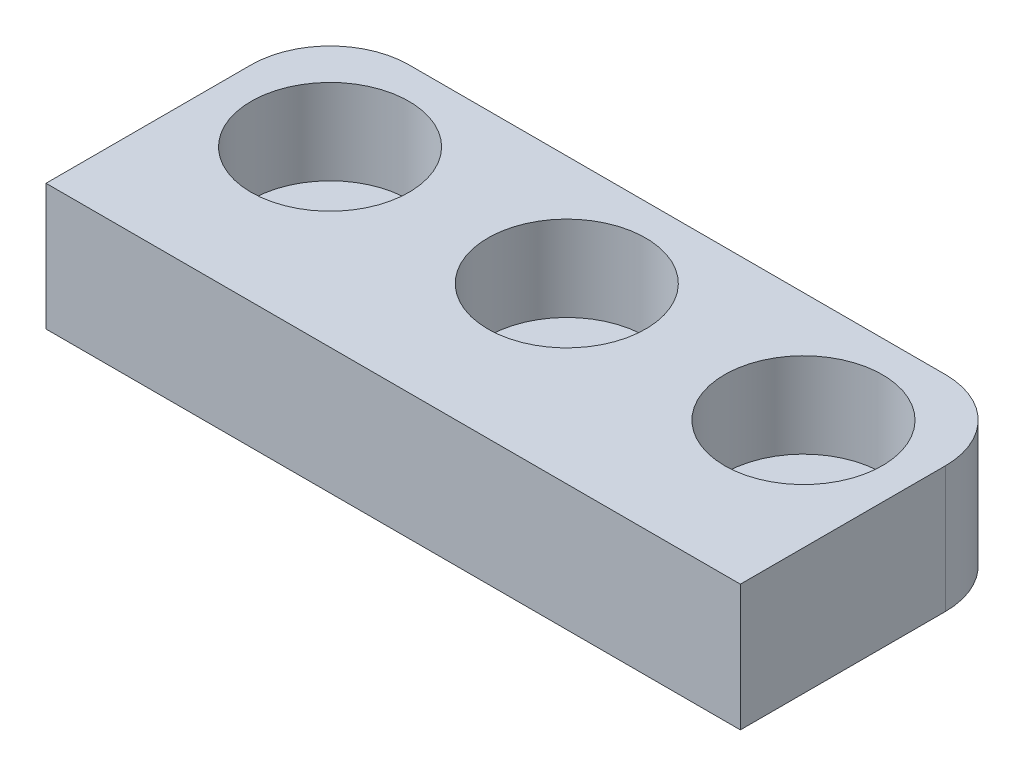
ISO-10303-21;
HEADER;
FILE_DESCRIPTION(('STEP AP214'),'2;1');
FILE_NAME('part.step','',(''),(''),'','','');
FILE_SCHEMA(('AUTOMOTIVE_DESIGN { 1 0 10303 214 1 1 1 1 }'));
ENDSEC;
DATA;
#1=APPLICATION_CONTEXT('core data for automotive mechanical design processes');
#2=APPLICATION_PROTOCOL_DEFINITION('international standard','automotive_design',2000,#1);
#3=PRODUCT_CONTEXT('',#1,'mechanical');
#4=PRODUCT('Part','Part','',(#3));
#5=PRODUCT_RELATED_PRODUCT_CATEGORY('part','',(#4));
#6=PRODUCT_DEFINITION_FORMATION('','',#4);
#7=PRODUCT_DEFINITION_CONTEXT('part definition',#1,'design');
#8=PRODUCT_DEFINITION('design','',#6,#7);
#9=PRODUCT_DEFINITION_SHAPE('','',#8);
#10=(LENGTH_UNIT() NAMED_UNIT(*) SI_UNIT(.MILLI.,.METRE.));
#11=(NAMED_UNIT(*) PLANE_ANGLE_UNIT() SI_UNIT($,.RADIAN.));
#12=(NAMED_UNIT(*) SI_UNIT($,.STERADIAN.) SOLID_ANGLE_UNIT());
#13=UNCERTAINTY_MEASURE_WITH_UNIT(LENGTH_MEASURE(1.E-05),#10,'distance_accuracy_value','');
#14=(GEOMETRIC_REPRESENTATION_CONTEXT(3) GLOBAL_UNCERTAINTY_ASSIGNED_CONTEXT((#13)) GLOBAL_UNIT_ASSIGNED_CONTEXT((#10,
#11,#12)) REPRESENTATION_CONTEXT('',''));
#15=CARTESIAN_POINT('',(0.,0.,0.));
#16=DIRECTION('',(0.,0.,1.));
#17=DIRECTION('',(1.,0.,0.));
#18=AXIS2_PLACEMENT_3D('',#15,#16,#17);
#19=CARTESIAN_POINT('',(22.,-8.,9.));
#20=DIRECTION('',(1.,0.,0.));
#21=DIRECTION('',(0.,0.,-1.));
#22=AXIS2_PLACEMENT_3D('',#19,#20,#21);
#23=PLANE('',#22);
#24=DIRECTION('',(0.,0.,-1.));
#25=VECTOR('',#24,1.);
#26=CARTESIAN_POINT('',(22.,-8.,9.));
#27=LINE('',#26,#25);
#28=CARTESIAN_POINT('',(22.,-8.,9.));
#29=VERTEX_POINT('',#28);
#30=CARTESIAN_POINT('',(22.,-8.,-4.));
#31=VERTEX_POINT('',#30);
#32=EDGE_CURVE('E111',#29,#31,#27,.T.);
#33=ORIENTED_EDGE('',*,*,#32,.T.);
#34=DIRECTION('',(0.,1.,0.));
#35=VECTOR('',#34,1.);
#36=CARTESIAN_POINT('',(22.,-8.,-4.));
#37=LINE('',#36,#35);
#38=CARTESIAN_POINT('',(22.,0.,-4.));
#39=VERTEX_POINT('',#38);
#40=EDGE_CURVE('E125',#31,#39,#37,.T.);
#41=ORIENTED_EDGE('',*,*,#40,.T.);
#42=DIRECTION('',(0.,0.,-1.));
#43=VECTOR('',#42,1.);
#44=CARTESIAN_POINT('',(22.,0.,9.));
#45=LINE('',#44,#43);
#46=CARTESIAN_POINT('',(22.,0.,9.));
#47=VERTEX_POINT('',#46);
#48=EDGE_CURVE('E115',#47,#39,#45,.T.);
#49=ORIENTED_EDGE('',*,*,#48,.F.);
#50=DIRECTION('',(0.,1.,0.));
#51=VECTOR('',#50,1.);
#52=CARTESIAN_POINT('',(22.,-8.,9.));
#53=LINE('',#52,#51);
#54=EDGE_CURVE('E106',#29,#47,#53,.T.);
#55=ORIENTED_EDGE('',*,*,#54,.F.);
#56=EDGE_LOOP('',(#33,#41,#49,#55));
#57=FACE_BOUND('',#56,.T.);
#58=ADVANCED_FACE('F41',(#57),#23,.T.);
#59=CARTESIAN_POINT('',(-22.,-8.,9.));
#60=DIRECTION('',(0.,0.,1.));
#61=DIRECTION('',(1.,0.,0.));
#62=AXIS2_PLACEMENT_3D('',#59,#60,#61);
#63=PLANE('',#62);
#64=DIRECTION('',(1.,0.,0.));
#65=VECTOR('',#64,1.);
#66=CARTESIAN_POINT('',(-22.,0.,9.));
#67=LINE('',#66,#65);
#68=CARTESIAN_POINT('',(-22.,0.,9.));
#69=VERTEX_POINT('',#68);
#70=EDGE_CURVE('E105',#69,#47,#67,.T.);
#71=ORIENTED_EDGE('',*,*,#70,.F.);
#72=DIRECTION('',(0.,1.,0.));
#73=VECTOR('',#72,1.);
#74=CARTESIAN_POINT('',(-22.,-8.,9.));
#75=LINE('',#74,#73);
#76=CARTESIAN_POINT('',(-22.,-8.,9.));
#77=VERTEX_POINT('',#76);
#78=EDGE_CURVE('E95',#77,#69,#75,.T.);
#79=ORIENTED_EDGE('',*,*,#78,.F.);
#80=DIRECTION('',(1.,0.,0.));
#81=VECTOR('',#80,1.);
#82=CARTESIAN_POINT('',(-22.,-8.,9.));
#83=LINE('',#82,#81);
#84=EDGE_CURVE('E98',#77,#29,#83,.T.);
#85=ORIENTED_EDGE('',*,*,#84,.T.);
#86=ORIENTED_EDGE('',*,*,#54,.T.);
#87=EDGE_LOOP('',(#71,#79,#85,#86));
#88=FACE_BOUND('',#87,.T.);
#89=ADVANCED_FACE('F103',(#88),#63,.T.);
#90=CARTESIAN_POINT('',(-22.,-8.,9.));
#91=DIRECTION('',(-1.,0.,0.));
#92=DIRECTION('',(0.,0.,1.));
#93=AXIS2_PLACEMENT_3D('',#90,#91,#92);
#94=PLANE('',#93);
#95=DIRECTION('',(0.,0.,1.));
#96=VECTOR('',#95,1.);
#97=CARTESIAN_POINT('',(-22.,0.,9.));
#98=LINE('',#97,#96);
#99=CARTESIAN_POINT('',(-22.,0.,-4.));
#100=VERTEX_POINT('',#99);
#101=EDGE_CURVE('E122',#100,#69,#98,.T.);
#102=ORIENTED_EDGE('',*,*,#101,.F.);
#103=DIRECTION('',(0.,1.,0.));
#104=VECTOR('',#103,1.);
#105=CARTESIAN_POINT('',(-22.,-8.,-4.));
#106=LINE('',#105,#104);
#107=CARTESIAN_POINT('',(-22.,-8.,-4.));
#108=VERTEX_POINT('',#107);
#109=EDGE_CURVE('E11',#100,#108,#106,.F.);
#110=ORIENTED_EDGE('',*,*,#109,.T.);
#111=DIRECTION('',(0.,0.,1.));
#112=VECTOR('',#111,1.);
#113=CARTESIAN_POINT('',(-22.,-8.,9.));
#114=LINE('',#113,#112);
#115=EDGE_CURVE('E92',#108,#77,#114,.T.);
#116=ORIENTED_EDGE('',*,*,#115,.T.);
#117=ORIENTED_EDGE('',*,*,#78,.T.);
#118=EDGE_LOOP('',(#102,#110,#116,#117));
#119=FACE_BOUND('',#118,.T.);
#120=ADVANCED_FACE('F94',(#119),#94,.T.);
#121=CARTESIAN_POINT('',(-22.,-8.,-9.));
#122=DIRECTION('',(0.,0.,-1.));
#123=DIRECTION('',(-1.,0.,0.));
#124=AXIS2_PLACEMENT_3D('',#121,#122,#123);
#125=PLANE('',#124);
#126=DIRECTION('',(-1.,0.,0.));
#127=VECTOR('',#126,1.);
#128=CARTESIAN_POINT('',(-22.,0.,-9.));
#129=LINE('',#128,#127);
#130=CARTESIAN_POINT('',(17.,0.,-9.));
#131=VERTEX_POINT('',#130);
#132=CARTESIAN_POINT('',(-17.,0.,-9.));
#133=VERTEX_POINT('',#132);
#134=EDGE_CURVE('E118',#131,#133,#129,.T.);
#135=ORIENTED_EDGE('',*,*,#134,.F.);
#136=DIRECTION('',(0.,1.,0.));
#137=VECTOR('',#136,1.);
#138=CARTESIAN_POINT('',(17.,-8.,-9.));
#139=LINE('',#138,#137);
#140=CARTESIAN_POINT('',(17.,-8.,-9.));
#141=VERTEX_POINT('',#140);
#142=EDGE_CURVE('E136',#131,#141,#139,.F.);
#143=ORIENTED_EDGE('',*,*,#142,.T.);
#144=DIRECTION('',(-1.,0.,0.));
#145=VECTOR('',#144,1.);
#146=CARTESIAN_POINT('',(-22.,-8.,-9.));
#147=LINE('',#146,#145);
#148=CARTESIAN_POINT('',(-17.,-8.,-9.));
#149=VERTEX_POINT('',#148);
#150=EDGE_CURVE('E99',#141,#149,#147,.T.);
#151=ORIENTED_EDGE('',*,*,#150,.T.);
#152=DIRECTION('',(0.,1.,0.));
#153=VECTOR('',#152,1.);
#154=CARTESIAN_POINT('',(-17.,-8.,-9.));
#155=LINE('',#154,#153);
#156=EDGE_CURVE('E133',#149,#133,#155,.T.);
#157=ORIENTED_EDGE('',*,*,#156,.T.);
#158=EDGE_LOOP('',(#135,#143,#151,#157));
#159=FACE_BOUND('',#158,.T.);
#160=ADVANCED_FACE('F150',(#159),#125,.T.);
#161=CARTESIAN_POINT('',(0.,-8.,0.));
#162=DIRECTION('',(0.,-1.,0.));
#163=DIRECTION('',(0.,0.,-1.));
#164=AXIS2_PLACEMENT_3D('',#161,#162,#163);
#165=PLANE('',#164);
#166=CARTESIAN_POINT('',(-15.,-8.,-2.));
#167=DIRECTION('',(0.,1.,0.));
#168=DIRECTION('',(0.,0.,1.));
#169=AXIS2_PLACEMENT_3D('',#166,#167,#168);
#170=CIRCLE('',#169,2.65);
#171=CARTESIAN_POINT('',(-15.,-8.,0.65));
#172=VERTEX_POINT('',#171);
#173=EDGE_CURVE('E224',#172,#172,#170,.T.);
#174=ORIENTED_EDGE('',*,*,#173,.T.);
#175=EDGE_LOOP('',(#174));
#176=FACE_BOUND('',#175,.T.);
#177=CARTESIAN_POINT('',(0.,-8.,-2.));
#178=DIRECTION('',(0.,1.,0.));
#179=DIRECTION('',(0.,0.,1.));
#180=AXIS2_PLACEMENT_3D('',#177,#178,#179);
#181=CIRCLE('',#180,2.65);
#182=CARTESIAN_POINT('',(0.,-8.,0.65));
#183=VERTEX_POINT('',#182);
#184=EDGE_CURVE('E236',#183,#183,#181,.T.);
#185=ORIENTED_EDGE('',*,*,#184,.T.);
#186=EDGE_LOOP('',(#185));
#187=FACE_BOUND('',#186,.T.);
#188=CARTESIAN_POINT('',(15.,-8.,-2.));
#189=DIRECTION('',(0.,1.,0.));
#190=DIRECTION('',(0.,0.,1.));
#191=AXIS2_PLACEMENT_3D('',#188,#189,#190);
#192=CIRCLE('',#191,2.65);
#193=CARTESIAN_POINT('',(15.,-8.,0.649999999999997));
#194=VERTEX_POINT('',#193);
#195=EDGE_CURVE('E119',#194,#194,#192,.T.);
#196=ORIENTED_EDGE('',*,*,#195,.T.);
#197=EDGE_LOOP('',(#196));
#198=FACE_BOUND('',#197,.T.);
#199=ORIENTED_EDGE('',*,*,#150,.F.);
#200=CARTESIAN_POINT('',(17.,-8.,-4.));
#201=DIRECTION('',(0.,-1.,0.));
#202=DIRECTION('',(0.,0.,-1.));
#203=AXIS2_PLACEMENT_3D('',#200,#201,#202);
#204=CIRCLE('',#203,5.);
#205=EDGE_CURVE('E49',#141,#31,#204,.T.);
#206=ORIENTED_EDGE('',*,*,#205,.T.);
#207=ORIENTED_EDGE('',*,*,#32,.F.);
#208=ORIENTED_EDGE('',*,*,#84,.F.);
#209=ORIENTED_EDGE('',*,*,#115,.F.);
#210=CARTESIAN_POINT('',(-17.,-8.,-4.));
#211=DIRECTION('',(0.,-1.,0.));
#212=DIRECTION('',(0.,0.,-1.));
#213=AXIS2_PLACEMENT_3D('',#210,#211,#212);
#214=CIRCLE('',#213,5.);
#215=EDGE_CURVE('E61',#108,#149,#214,.T.);
#216=ORIENTED_EDGE('',*,*,#215,.T.);
#217=EDGE_LOOP('',(#199,#206,#207,#208,#209,#216));
#218=FACE_BOUND('',#217,.T.);
#219=ADVANCED_FACE('F109',(#176,#187,#198,#218),#165,.T.);
#220=CARTESIAN_POINT('',(0.,0.,0.));
#221=DIRECTION('',(0.,-1.,0.));
#222=DIRECTION('',(0.,0.,-1.));
#223=AXIS2_PLACEMENT_3D('',#220,#221,#222);
#224=PLANE('',#223);
#225=CARTESIAN_POINT('',(-15.,0.,-2.));
#226=DIRECTION('',(0.,1.,0.));
#227=DIRECTION('',(0.,0.,1.));
#228=AXIS2_PLACEMENT_3D('',#225,#226,#227);
#229=CIRCLE('',#228,5.);
#230=CARTESIAN_POINT('',(-15.,0.,3.));
#231=VERTEX_POINT('',#230);
#232=EDGE_CURVE('E217',#231,#231,#229,.T.);
#233=ORIENTED_EDGE('',*,*,#232,.F.);
#234=EDGE_LOOP('',(#233));
#235=FACE_BOUND('',#234,.T.);
#236=CARTESIAN_POINT('',(0.,0.,-2.));
#237=DIRECTION('',(0.,1.,0.));
#238=DIRECTION('',(0.,0.,1.));
#239=AXIS2_PLACEMENT_3D('',#236,#237,#238);
#240=CIRCLE('',#239,5.);
#241=CARTESIAN_POINT('',(0.,0.,3.));
#242=VERTEX_POINT('',#241);
#243=EDGE_CURVE('E227',#242,#242,#240,.T.);
#244=ORIENTED_EDGE('',*,*,#243,.F.);
#245=EDGE_LOOP('',(#244));
#246=FACE_BOUND('',#245,.T.);
#247=CARTESIAN_POINT('',(15.,0.,-2.));
#248=DIRECTION('',(0.,1.,0.));
#249=DIRECTION('',(0.,0.,1.));
#250=AXIS2_PLACEMENT_3D('',#247,#248,#249);
#251=CIRCLE('',#250,5.);
#252=CARTESIAN_POINT('',(15.,0.,3.));
#253=VERTEX_POINT('',#252);
#254=EDGE_CURVE('E239',#253,#253,#251,.T.);
#255=ORIENTED_EDGE('',*,*,#254,.F.);
#256=EDGE_LOOP('',(#255));
#257=FACE_BOUND('',#256,.T.);
#258=ORIENTED_EDGE('',*,*,#48,.T.);
#259=CARTESIAN_POINT('',(17.,0.,-4.));
#260=DIRECTION('',(0.,-1.,0.));
#261=DIRECTION('',(0.,0.,-1.));
#262=AXIS2_PLACEMENT_3D('',#259,#260,#261);
#263=CIRCLE('',#262,5.);
#264=EDGE_CURVE('E131',#39,#131,#263,.F.);
#265=ORIENTED_EDGE('',*,*,#264,.T.);
#266=ORIENTED_EDGE('',*,*,#134,.T.);
#267=CARTESIAN_POINT('',(-17.,0.,-4.));
#268=DIRECTION('',(0.,-1.,0.));
#269=DIRECTION('',(0.,0.,-1.));
#270=AXIS2_PLACEMENT_3D('',#267,#268,#269);
#271=CIRCLE('',#270,5.);
#272=EDGE_CURVE('E129',#133,#100,#271,.F.);
#273=ORIENTED_EDGE('',*,*,#272,.T.);
#274=ORIENTED_EDGE('',*,*,#101,.T.);
#275=ORIENTED_EDGE('',*,*,#70,.T.);
#276=EDGE_LOOP('',(#258,#265,#266,#273,#274,#275));
#277=FACE_BOUND('',#276,.T.);
#278=ADVANCED_FACE('F148',(#235,#246,#257,#277),#224,.F.);
#279=CARTESIAN_POINT('',(15.,0.,-2.));
#280=DIRECTION('',(0.,1.,0.));
#281=DIRECTION('',(0.,0.,1.));
#282=AXIS2_PLACEMENT_3D('',#279,#280,#281);
#283=CYLINDRICAL_SURFACE('',#282,2.65);
#284=ORIENTED_EDGE('',*,*,#195,.F.);
#285=EDGE_LOOP('',(#284));
#286=FACE_BOUND('',#285,.T.);
#287=CARTESIAN_POINT('',(15.,-5.4,-2.));
#288=DIRECTION('',(0.,1.,0.));
#289=DIRECTION('',(0.,0.,1.));
#290=AXIS2_PLACEMENT_3D('',#287,#288,#289);
#291=CIRCLE('',#290,2.65);
#292=CARTESIAN_POINT('',(15.,-5.4,0.649999999999997));
#293=VERTEX_POINT('',#292);
#294=EDGE_CURVE('E245',#293,#293,#291,.T.);
#295=ORIENTED_EDGE('',*,*,#294,.T.);
#296=EDGE_LOOP('',(#295));
#297=FACE_BOUND('',#296,.T.);
#298=ADVANCED_FACE('F172',(#286,#297),#283,.F.);
#299=CARTESIAN_POINT('',(17.65,-5.4,-2.));
#300=DIRECTION('',(0.,-1.,0.));
#301=DIRECTION('',(0.,0.,-1.));
#302=AXIS2_PLACEMENT_3D('',#299,#300,#301);
#303=PLANE('',#302);
#304=ORIENTED_EDGE('',*,*,#294,.F.);
#305=EDGE_LOOP('',(#304));
#306=FACE_BOUND('',#305,.T.);
#307=CARTESIAN_POINT('',(15.,-5.4,-2.));
#308=DIRECTION('',(0.,1.,0.));
#309=DIRECTION('',(0.,0.,1.));
#310=AXIS2_PLACEMENT_3D('',#307,#308,#309);
#311=CIRCLE('',#310,5.);
#312=CARTESIAN_POINT('',(15.,-5.4,2.99999999999999));
#313=VERTEX_POINT('',#312);
#314=EDGE_CURVE('E242',#313,#313,#311,.T.);
#315=ORIENTED_EDGE('',*,*,#314,.T.);
#316=EDGE_LOOP('',(#315));
#317=FACE_BOUND('',#316,.T.);
#318=ADVANCED_FACE('F179',(#306,#317),#303,.F.);
#319=CARTESIAN_POINT('',(15.,0.,-2.));
#320=DIRECTION('',(0.,1.,0.));
#321=DIRECTION('',(0.,0.,1.));
#322=AXIS2_PLACEMENT_3D('',#319,#320,#321);
#323=CYLINDRICAL_SURFACE('',#322,5.);
#324=ORIENTED_EDGE('',*,*,#314,.F.);
#325=EDGE_LOOP('',(#324));
#326=FACE_BOUND('',#325,.T.);
#327=ORIENTED_EDGE('',*,*,#254,.T.);
#328=EDGE_LOOP('',(#327));
#329=FACE_BOUND('',#328,.T.);
#330=ADVANCED_FACE('F183',(#326,#329),#323,.F.);
#331=CARTESIAN_POINT('',(0.,0.,-2.));
#332=DIRECTION('',(0.,1.,0.));
#333=DIRECTION('',(0.,0.,1.));
#334=AXIS2_PLACEMENT_3D('',#331,#332,#333);
#335=CYLINDRICAL_SURFACE('',#334,2.65);
#336=ORIENTED_EDGE('',*,*,#184,.F.);
#337=EDGE_LOOP('',(#336));
#338=FACE_BOUND('',#337,.T.);
#339=CARTESIAN_POINT('',(0.,-5.4,-2.));
#340=DIRECTION('',(0.,1.,0.));
#341=DIRECTION('',(0.,0.,1.));
#342=AXIS2_PLACEMENT_3D('',#339,#340,#341);
#343=CIRCLE('',#342,2.65);
#344=CARTESIAN_POINT('',(0.,-5.4,0.650000000000001));
#345=VERTEX_POINT('',#344);
#346=EDGE_CURVE('E233',#345,#345,#343,.T.);
#347=ORIENTED_EDGE('',*,*,#346,.T.);
#348=EDGE_LOOP('',(#347));
#349=FACE_BOUND('',#348,.T.);
#350=ADVANCED_FACE('F187',(#338,#349),#335,.F.);
#351=CARTESIAN_POINT('',(2.65,-5.4,-2.));
#352=DIRECTION('',(0.,-1.,0.));
#353=DIRECTION('',(0.,0.,-1.));
#354=AXIS2_PLACEMENT_3D('',#351,#352,#353);
#355=PLANE('',#354);
#356=ORIENTED_EDGE('',*,*,#346,.F.);
#357=EDGE_LOOP('',(#356));
#358=FACE_BOUND('',#357,.T.);
#359=CARTESIAN_POINT('',(0.,-5.4,-2.));
#360=DIRECTION('',(0.,1.,0.));
#361=DIRECTION('',(0.,0.,1.));
#362=AXIS2_PLACEMENT_3D('',#359,#360,#361);
#363=CIRCLE('',#362,5.);
#364=CARTESIAN_POINT('',(0.,-5.4,3.));
#365=VERTEX_POINT('',#364);
#366=EDGE_CURVE('E230',#365,#365,#363,.T.);
#367=ORIENTED_EDGE('',*,*,#366,.T.);
#368=EDGE_LOOP('',(#367));
#369=FACE_BOUND('',#368,.T.);
#370=ADVANCED_FACE('F191',(#358,#369),#355,.F.);
#371=CARTESIAN_POINT('',(0.,0.,-2.));
#372=DIRECTION('',(0.,1.,0.));
#373=DIRECTION('',(0.,0.,1.));
#374=AXIS2_PLACEMENT_3D('',#371,#372,#373);
#375=CYLINDRICAL_SURFACE('',#374,5.);
#376=ORIENTED_EDGE('',*,*,#366,.F.);
#377=EDGE_LOOP('',(#376));
#378=FACE_BOUND('',#377,.T.);
#379=ORIENTED_EDGE('',*,*,#243,.T.);
#380=EDGE_LOOP('',(#379));
#381=FACE_BOUND('',#380,.T.);
#382=ADVANCED_FACE('F195',(#378,#381),#375,.F.);
#383=CARTESIAN_POINT('',(-15.,0.,-2.));
#384=DIRECTION('',(0.,1.,0.));
#385=DIRECTION('',(0.,0.,1.));
#386=AXIS2_PLACEMENT_3D('',#383,#384,#385);
#387=CYLINDRICAL_SURFACE('',#386,2.65);
#388=ORIENTED_EDGE('',*,*,#173,.F.);
#389=EDGE_LOOP('',(#388));
#390=FACE_BOUND('',#389,.T.);
#391=CARTESIAN_POINT('',(-15.,-5.4,-2.));
#392=DIRECTION('',(0.,1.,0.));
#393=DIRECTION('',(0.,0.,1.));
#394=AXIS2_PLACEMENT_3D('',#391,#392,#393);
#395=CIRCLE('',#394,2.65);
#396=CARTESIAN_POINT('',(-15.,-5.4,0.65));
#397=VERTEX_POINT('',#396);
#398=EDGE_CURVE('E219',#397,#397,#395,.T.);
#399=ORIENTED_EDGE('',*,*,#398,.T.);
#400=EDGE_LOOP('',(#399));
#401=FACE_BOUND('',#400,.T.);
#402=ADVANCED_FACE('F199',(#390,#401),#387,.F.);
#403=CARTESIAN_POINT('',(-12.35,-5.4,-2.));
#404=DIRECTION('',(0.,-1.,0.));
#405=DIRECTION('',(0.,0.,-1.));
#406=AXIS2_PLACEMENT_3D('',#403,#404,#405);
#407=PLANE('',#406);
#408=ORIENTED_EDGE('',*,*,#398,.F.);
#409=EDGE_LOOP('',(#408));
#410=FACE_BOUND('',#409,.T.);
#411=CARTESIAN_POINT('',(-15.,-5.4,-2.));
#412=DIRECTION('',(0.,1.,0.));
#413=DIRECTION('',(0.,0.,1.));
#414=AXIS2_PLACEMENT_3D('',#411,#412,#413);
#415=CIRCLE('',#414,5.);
#416=CARTESIAN_POINT('',(-15.,-5.4,3.));
#417=VERTEX_POINT('',#416);
#418=EDGE_CURVE('E214',#417,#417,#415,.T.);
#419=ORIENTED_EDGE('',*,*,#418,.T.);
#420=EDGE_LOOP('',(#419));
#421=FACE_BOUND('',#420,.T.);
#422=ADVANCED_FACE('F203',(#410,#421),#407,.F.);
#423=CARTESIAN_POINT('',(-15.,0.,-2.));
#424=DIRECTION('',(0.,1.,0.));
#425=DIRECTION('',(0.,0.,1.));
#426=AXIS2_PLACEMENT_3D('',#423,#424,#425);
#427=CYLINDRICAL_SURFACE('',#426,5.);
#428=ORIENTED_EDGE('',*,*,#418,.F.);
#429=EDGE_LOOP('',(#428));
#430=FACE_BOUND('',#429,.T.);
#431=ORIENTED_EDGE('',*,*,#232,.T.);
#432=EDGE_LOOP('',(#431));
#433=FACE_BOUND('',#432,.T.);
#434=ADVANCED_FACE('F157',(#430,#433),#427,.F.);
#435=CARTESIAN_POINT('',(17.,-8.,-4.));
#436=DIRECTION('',(0.,1.,0.));
#437=DIRECTION('',(0.,0.,1.));
#438=AXIS2_PLACEMENT_3D('',#435,#436,#437);
#439=CYLINDRICAL_SURFACE('',#438,5.);
#440=ORIENTED_EDGE('',*,*,#205,.F.);
#441=ORIENTED_EDGE('',*,*,#142,.F.);
#442=ORIENTED_EDGE('',*,*,#264,.F.);
#443=ORIENTED_EDGE('',*,*,#40,.F.);
#444=EDGE_LOOP('',(#440,#441,#442,#443));
#445=FACE_BOUND('',#444,.T.);
#446=ADVANCED_FACE('F145',(#445),#439,.T.);
#447=CARTESIAN_POINT('',(-17.,-8.,-4.));
#448=DIRECTION('',(0.,1.,0.));
#449=DIRECTION('',(0.,0.,1.));
#450=AXIS2_PLACEMENT_3D('',#447,#448,#449);
#451=CYLINDRICAL_SURFACE('',#450,5.);
#452=ORIENTED_EDGE('',*,*,#215,.F.);
#453=ORIENTED_EDGE('',*,*,#109,.F.);
#454=ORIENTED_EDGE('',*,*,#272,.F.);
#455=ORIENTED_EDGE('',*,*,#156,.F.);
#456=EDGE_LOOP('',(#452,#453,#454,#455));
#457=FACE_BOUND('',#456,.T.);
#458=ADVANCED_FACE('F43',(#457),#451,.T.);
#459=CLOSED_SHELL('',(#58,#89,#120,#160,#219,#278,#298,#318,#330,#350,#370,#382,#402,#422,#434,
#446,#458));
#460=MANIFOLD_SOLID_BREP('B2',#459);
#461=ADVANCED_BREP_SHAPE_REPRESENTATION('',(#18,#460),#14);
#462=SHAPE_DEFINITION_REPRESENTATION(#9,#461);
ENDSEC;
END-ISO-10303-21;
